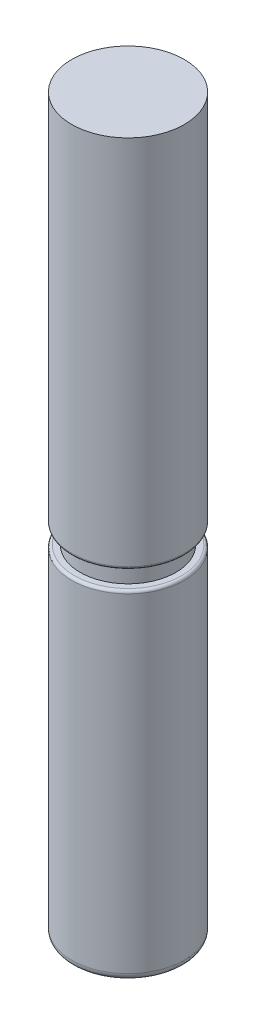
ISO-10303-21;
HEADER;
FILE_DESCRIPTION(('STEP AP214'),'2;1');
FILE_NAME('part.step','',(''),(''),'','','');
FILE_SCHEMA(('AUTOMOTIVE_DESIGN { 1 0 10303 214 1 1 1 1 }'));
ENDSEC;
DATA;
#1=APPLICATION_CONTEXT('core data for automotive mechanical design processes');
#2=APPLICATION_PROTOCOL_DEFINITION('international standard','automotive_design',2000,#1);
#3=PRODUCT_CONTEXT('',#1,'mechanical');
#4=PRODUCT('Part','Part','',(#3));
#5=PRODUCT_RELATED_PRODUCT_CATEGORY('part','',(#4));
#6=PRODUCT_DEFINITION_FORMATION('','',#4);
#7=PRODUCT_DEFINITION_CONTEXT('part definition',#1,'design');
#8=PRODUCT_DEFINITION('design','',#6,#7);
#9=PRODUCT_DEFINITION_SHAPE('','',#8);
#10=(LENGTH_UNIT() NAMED_UNIT(*) SI_UNIT(.MILLI.,.METRE.));
#11=(NAMED_UNIT(*) PLANE_ANGLE_UNIT() SI_UNIT($,.RADIAN.));
#12=(NAMED_UNIT(*) SI_UNIT($,.STERADIAN.) SOLID_ANGLE_UNIT());
#13=UNCERTAINTY_MEASURE_WITH_UNIT(LENGTH_MEASURE(1.E-05),#10,'distance_accuracy_value','');
#14=(GEOMETRIC_REPRESENTATION_CONTEXT(3) GLOBAL_UNCERTAINTY_ASSIGNED_CONTEXT((#13)) GLOBAL_UNIT_ASSIGNED_CONTEXT((#10,
#11,#12)) REPRESENTATION_CONTEXT('',''));
#15=CARTESIAN_POINT('',(0.,0.,0.));
#16=DIRECTION('',(0.,0.,1.));
#17=DIRECTION('',(1.,0.,0.));
#18=AXIS2_PLACEMENT_3D('',#15,#16,#17);
#19=CARTESIAN_POINT('',(0.,-17.9324,0.));
#20=DIRECTION('',(0.,-1.,0.));
#21=DIRECTION('',(0.,0.,-1.));
#22=AXIS2_PLACEMENT_3D('',#19,#20,#21);
#23=PLANE('',#22);
#24=CARTESIAN_POINT('',(0.,-17.9324,0.));
#25=DIRECTION('',(0.,1.,0.));
#26=DIRECTION('',(0.,0.,1.));
#27=AXIS2_PLACEMENT_3D('',#24,#25,#26);
#28=CIRCLE('',#27,1.38049);
#29=CARTESIAN_POINT('',(0.,-17.9324,1.38049));
#30=VERTEX_POINT('',#29);
#31=CARTESIAN_POINT('',(-1.15201031041941,-17.9324,-0.760673967470543));
#32=VERTEX_POINT('',#31);
#33=EDGE_CURVE('E53',#30,#32,#28,.T.);
#34=ORIENTED_EDGE('',*,*,#33,.F.);
#35=CARTESIAN_POINT('',(0.,-17.9324,0.));
#36=DIRECTION('',(0.,1.,0.));
#37=DIRECTION('',(-0.834493774253641,0.,-0.551017368811469));
#38=AXIS2_PLACEMENT_3D('',#35,#36,#37);
#39=CIRCLE('',#38,1.38049);
#40=EDGE_CURVE('E50',#32,#30,#39,.T.);
#41=ORIENTED_EDGE('',*,*,#40,.F.);
#42=EDGE_LOOP('',(#34,#41));
#43=FACE_BOUND('',#42,.T.);
#44=ADVANCED_FACE('F17',(#43),#23,.T.);
#45=CARTESIAN_POINT('',(0.,-17.7292,0.));
#46=DIRECTION('',(0.,-1.,0.));
#47=DIRECTION('',(0.,0.,-1.));
#48=AXIS2_PLACEMENT_3D('',#45,#46,#47);
#49=TOROIDAL_SURFACE('',#48,1.38049,0.2032);
#50=CARTESIAN_POINT('',(0.,-17.7292,0.));
#51=DIRECTION('',(0.,-1.,0.));
#52=DIRECTION('',(0.,0.,-1.));
#53=AXIS2_PLACEMENT_3D('',#50,#51,#52);
#54=CIRCLE('',#53,1.58369);
#55=CARTESIAN_POINT('',(0.,-17.7292,-1.58369));
#56=VERTEX_POINT('',#55);
#57=EDGE_CURVE('E61',#56,#56,#54,.F.);
#58=ORIENTED_EDGE('',*,*,#57,.F.);
#59=EDGE_LOOP('',(#58));
#60=FACE_BOUND('',#59,.T.);
#61=ORIENTED_EDGE('',*,*,#40,.T.);
#62=ORIENTED_EDGE('',*,*,#33,.T.);
#63=EDGE_LOOP('',(#61,#62));
#64=FACE_BOUND('',#63,.T.);
#65=ADVANCED_FACE('F60',(#60,#64),#49,.T.);
#66=CARTESIAN_POINT('',(0.,-17.9324,0.));
#67=DIRECTION('',(0.,-1.,0.));
#68=DIRECTION('',(0.,0.,-1.));
#69=AXIS2_PLACEMENT_3D('',#66,#67,#68);
#70=CYLINDRICAL_SURFACE('',#69,1.58369);
#71=CARTESIAN_POINT('',(0.,-8.4836,0.));
#72=DIRECTION('',(0.,-1.,0.));
#73=DIRECTION('',(0.,0.,-1.));
#74=AXIS2_PLACEMENT_3D('',#71,#72,#73);
#75=CIRCLE('',#74,1.58369);
#76=CARTESIAN_POINT('',(0.,-8.4836,-1.58369));
#77=VERTEX_POINT('',#76);
#78=EDGE_CURVE('E85',#77,#77,#75,.F.);
#79=ORIENTED_EDGE('',*,*,#78,.F.);
#80=EDGE_LOOP('',(#79));
#81=FACE_BOUND('',#80,.T.);
#82=ORIENTED_EDGE('',*,*,#57,.T.);
#83=EDGE_LOOP('',(#82));
#84=FACE_BOUND('',#83,.T.);
#85=ADVANCED_FACE('F77',(#81,#84),#70,.T.);
#86=CARTESIAN_POINT('',(0.,-8.4836,0.));
#87=DIRECTION('',(0.,-1.,0.));
#88=DIRECTION('',(0.,0.,-1.));
#89=AXIS2_PLACEMENT_3D('',#86,#87,#88);
#90=TOROIDAL_SURFACE('',#89,1.50749,0.0762);
#91=CARTESIAN_POINT('',(0.,-8.4074,0.));
#92=DIRECTION('',(0.,-1.,0.));
#93=DIRECTION('',(0.551017368811469,0.,-0.834493774253641));
#94=AXIS2_PLACEMENT_3D('',#91,#92,#93);
#95=CIRCLE('',#94,1.50749);
#96=CARTESIAN_POINT('',(0.,-8.4074,1.50749));
#97=VERTEX_POINT('',#96);
#98=CARTESIAN_POINT('',(0.830653173309602,-8.4074,-1.25799101974962));
#99=VERTEX_POINT('',#98);
#100=EDGE_CURVE('E88',#97,#99,#95,.F.);
#101=ORIENTED_EDGE('',*,*,#100,.F.);
#102=CARTESIAN_POINT('',(0.,-8.4074,0.));
#103=DIRECTION('',(0.,-1.,0.));
#104=DIRECTION('',(0.,0.,1.));
#105=AXIS2_PLACEMENT_3D('',#102,#103,#104);
#106=CIRCLE('',#105,1.50749);
#107=EDGE_CURVE('E119',#99,#97,#106,.F.);
#108=ORIENTED_EDGE('',*,*,#107,.F.);
#109=EDGE_LOOP('',(#101,#108));
#110=FACE_BOUND('',#109,.T.);
#111=ORIENTED_EDGE('',*,*,#78,.T.);
#112=EDGE_LOOP('',(#111));
#113=FACE_BOUND('',#112,.T.);
#114=ADVANCED_FACE('F97',(#110,#113),#90,.T.);
#115=CARTESIAN_POINT('',(0.,-8.4074,0.));
#116=DIRECTION('',(0.,1.,0.));
#117=DIRECTION('',(0.,0.,1.));
#118=AXIS2_PLACEMENT_3D('',#115,#116,#117);
#119=PLANE('',#118);
#120=CARTESIAN_POINT('',(0.,-8.4074,0.));
#121=DIRECTION('',(0.,-1.,0.));
#122=DIRECTION('',(0.,0.,-1.));
#123=AXIS2_PLACEMENT_3D('',#120,#121,#122);
#124=CIRCLE('',#123,1.3462);
#125=CARTESIAN_POINT('',(0.,-8.4074,-1.3462));
#126=VERTEX_POINT('',#125);
#127=EDGE_CURVE('E21',#126,#126,#124,.F.);
#128=ORIENTED_EDGE('',*,*,#127,.F.);
#129=EDGE_LOOP('',(#128));
#130=FACE_BOUND('',#129,.T.);
#131=ORIENTED_EDGE('',*,*,#100,.T.);
#132=ORIENTED_EDGE('',*,*,#107,.T.);
#133=EDGE_LOOP('',(#131,#132));
#134=FACE_BOUND('',#133,.T.);
#135=ADVANCED_FACE('F107',(#130,#134),#119,.T.);
#136=CARTESIAN_POINT('',(0.,-17.9324,0.));
#137=DIRECTION('',(0.,-1.,0.));
#138=DIRECTION('',(0.,0.,-1.));
#139=AXIS2_PLACEMENT_3D('',#136,#137,#138);
#140=CYLINDRICAL_SURFACE('',#139,1.3462);
#141=CARTESIAN_POINT('',(0.,-7.8994,0.));
#142=DIRECTION('',(0.,-1.,0.));
#143=DIRECTION('',(0.,0.,-1.));
#144=AXIS2_PLACEMENT_3D('',#141,#142,#143);
#145=CIRCLE('',#144,1.3462);
#146=CARTESIAN_POINT('',(0.,-7.8994,-1.3462));
#147=VERTEX_POINT('',#146);
#148=EDGE_CURVE('E194',#147,#147,#145,.T.);
#149=ORIENTED_EDGE('',*,*,#148,.T.);
#150=EDGE_LOOP('',(#149));
#151=FACE_BOUND('',#150,.T.);
#152=ORIENTED_EDGE('',*,*,#127,.T.);
#153=EDGE_LOOP('',(#152));
#154=FACE_BOUND('',#153,.T.);
#155=ADVANCED_FACE('F208',(#151,#154),#140,.T.);
#156=CARTESIAN_POINT('',(0.,-7.8994,0.));
#157=DIRECTION('',(0.,1.,0.));
#158=DIRECTION('',(0.,0.,1.));
#159=AXIS2_PLACEMENT_3D('',#156,#157,#158);
#160=PLANE('',#159);
#161=ORIENTED_EDGE('',*,*,#148,.F.);
#162=EDGE_LOOP('',(#161));
#163=FACE_BOUND('',#162,.T.);
#164=CARTESIAN_POINT('',(0.,-7.8994,0.));
#165=DIRECTION('',(0.,1.,0.));
#166=DIRECTION('',(0.551017368811468,0.,-0.834493774253641));
#167=AXIS2_PLACEMENT_3D('',#164,#165,#166);
#168=CIRCLE('',#167,1.50749);
#169=CARTESIAN_POINT('',(0.830653173309602,-7.8994,-1.25799101974962));
#170=VERTEX_POINT('',#169);
#171=CARTESIAN_POINT('',(0.,-7.8994,1.50749));
#172=VERTEX_POINT('',#171);
#173=EDGE_CURVE('E35',#170,#172,#168,.T.);
#174=ORIENTED_EDGE('',*,*,#173,.F.);
#175=CARTESIAN_POINT('',(0.,-7.8994,0.));
#176=DIRECTION('',(0.,1.,0.));
#177=DIRECTION('',(0.,0.,1.));
#178=AXIS2_PLACEMENT_3D('',#175,#176,#177);
#179=CIRCLE('',#178,1.50749);
#180=EDGE_CURVE('E177',#172,#170,#179,.T.);
#181=ORIENTED_EDGE('',*,*,#180,.F.);
#182=EDGE_LOOP('',(#174,#181));
#183=FACE_BOUND('',#182,.T.);
#184=ADVANCED_FACE('F157',(#163,#183),#160,.F.);
#185=CARTESIAN_POINT('',(0.,-7.8232,0.));
#186=DIRECTION('',(0.,-1.,0.));
#187=DIRECTION('',(0.,0.,-1.));
#188=AXIS2_PLACEMENT_3D('',#185,#186,#187);
#189=TOROIDAL_SURFACE('',#188,1.50749,0.0762);
#190=CARTESIAN_POINT('',(0.,-7.8232,0.));
#191=DIRECTION('',(0.,-1.,0.));
#192=DIRECTION('',(0.,0.,-1.));
#193=AXIS2_PLACEMENT_3D('',#190,#191,#192);
#194=CIRCLE('',#193,1.58369);
#195=CARTESIAN_POINT('',(0.,-7.8232,-1.58369));
#196=VERTEX_POINT('',#195);
#197=EDGE_CURVE('E27',#196,#196,#194,.F.);
#198=ORIENTED_EDGE('',*,*,#197,.F.);
#199=EDGE_LOOP('',(#198));
#200=FACE_BOUND('',#199,.T.);
#201=ORIENTED_EDGE('',*,*,#173,.T.);
#202=ORIENTED_EDGE('',*,*,#180,.T.);
#203=EDGE_LOOP('',(#201,#202));
#204=FACE_BOUND('',#203,.T.);
#205=ADVANCED_FACE('F145',(#200,#204),#189,.T.);
#206=CARTESIAN_POINT('',(0.,2.6162,0.));
#207=DIRECTION('',(0.,1.,0.));
#208=DIRECTION('',(0.,0.,1.));
#209=AXIS2_PLACEMENT_3D('',#206,#207,#208);
#210=PLANE('',#209);
#211=CARTESIAN_POINT('',(0.,2.6162,0.));
#212=DIRECTION('',(0.,-1.,0.));
#213=DIRECTION('',(0.,0.,-1.));
#214=AXIS2_PLACEMENT_3D('',#211,#212,#213);
#215=CIRCLE('',#214,1.58369);
#216=CARTESIAN_POINT('',(0.,2.6162,-1.58369));
#217=VERTEX_POINT('',#216);
#218=EDGE_CURVE('E11',#217,#217,#215,.T.);
#219=ORIENTED_EDGE('',*,*,#218,.F.);
#220=EDGE_LOOP('',(#219));
#221=FACE_BOUND('',#220,.T.);
#222=ADVANCED_FACE('F156',(#221),#210,.T.);
#223=CARTESIAN_POINT('',(0.,-17.9324,0.));
#224=DIRECTION('',(0.,-1.,0.));
#225=DIRECTION('',(0.,0.,-1.));
#226=AXIS2_PLACEMENT_3D('',#223,#224,#225);
#227=CYLINDRICAL_SURFACE('',#226,1.58369);
#228=ORIENTED_EDGE('',*,*,#218,.T.);
#229=EDGE_LOOP('',(#228));
#230=FACE_BOUND('',#229,.T.);
#231=ORIENTED_EDGE('',*,*,#197,.T.);
#232=EDGE_LOOP('',(#231));
#233=FACE_BOUND('',#232,.T.);
#234=ADVANCED_FACE('F215',(#230,#233),#227,.T.);
#235=CLOSED_SHELL('',(#44,#65,#85,#114,#135,#155,#184,#205,#222,#234));
#236=MANIFOLD_SOLID_BREP('B1',#235);
#237=ADVANCED_BREP_SHAPE_REPRESENTATION('',(#18,#236),#14);
#238=SHAPE_DEFINITION_REPRESENTATION(#9,#237);
ENDSEC;
END-ISO-10303-21;
